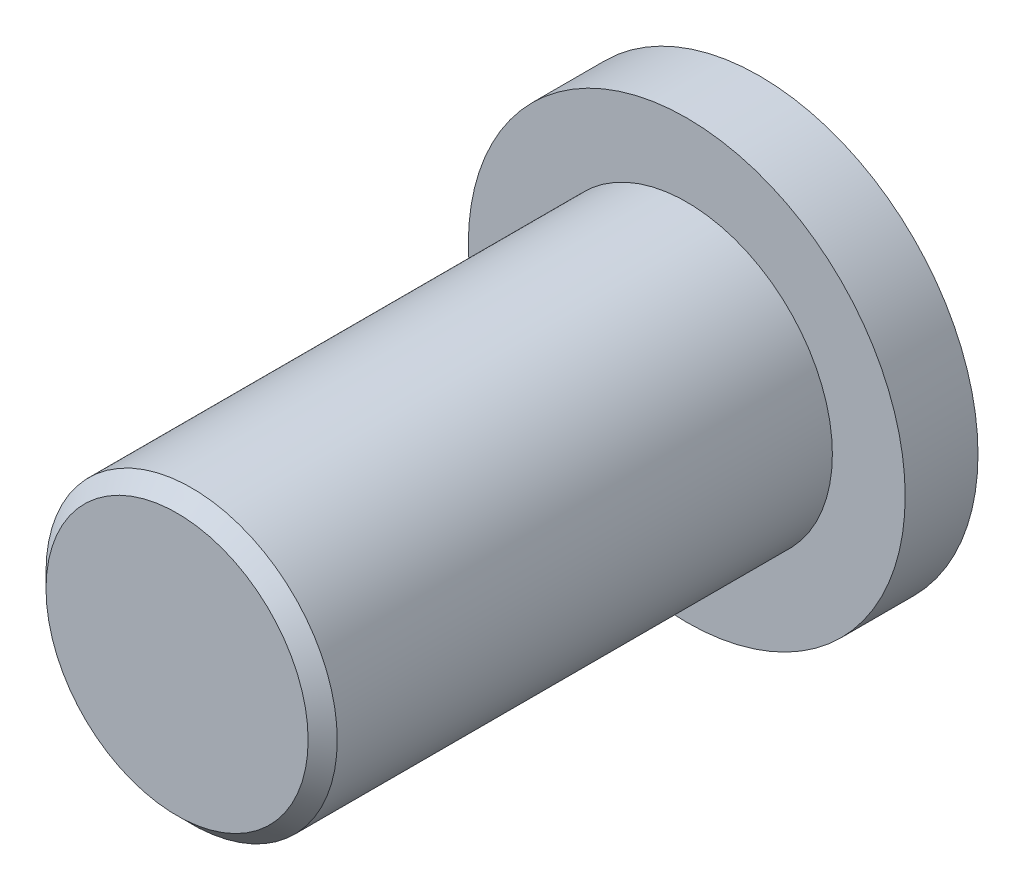
ISO-10303-21;
HEADER;
FILE_DESCRIPTION(('STEP AP214'),'2;1');
FILE_NAME('part.step','',(''),(''),'','','');
FILE_SCHEMA(('AUTOMOTIVE_DESIGN { 1 0 10303 214 1 1 1 1 }'));
ENDSEC;
DATA;
#1=APPLICATION_CONTEXT('core data for automotive mechanical design processes');
#2=APPLICATION_PROTOCOL_DEFINITION('international standard','automotive_design',2000,#1);
#3=PRODUCT_CONTEXT('',#1,'mechanical');
#4=PRODUCT('Part','Part','',(#3));
#5=PRODUCT_RELATED_PRODUCT_CATEGORY('part','',(#4));
#6=PRODUCT_DEFINITION_FORMATION('','',#4);
#7=PRODUCT_DEFINITION_CONTEXT('part definition',#1,'design');
#8=PRODUCT_DEFINITION('design','',#6,#7);
#9=PRODUCT_DEFINITION_SHAPE('','',#8);
#10=(LENGTH_UNIT() NAMED_UNIT(*) SI_UNIT(.MILLI.,.METRE.));
#11=(NAMED_UNIT(*) PLANE_ANGLE_UNIT() SI_UNIT($,.RADIAN.));
#12=(NAMED_UNIT(*) SI_UNIT($,.STERADIAN.) SOLID_ANGLE_UNIT());
#13=UNCERTAINTY_MEASURE_WITH_UNIT(LENGTH_MEASURE(1.E-05),#10,'distance_accuracy_value','');
#14=(GEOMETRIC_REPRESENTATION_CONTEXT(3) GLOBAL_UNCERTAINTY_ASSIGNED_CONTEXT((#13)) GLOBAL_UNIT_ASSIGNED_CONTEXT((#10,
#11,#12)) REPRESENTATION_CONTEXT('',''));
#15=CARTESIAN_POINT('',(0.,0.,0.));
#16=DIRECTION('',(0.,0.,1.));
#17=DIRECTION('',(1.,0.,0.));
#18=AXIS2_PLACEMENT_3D('',#15,#16,#17);
#19=CARTESIAN_POINT('',(0.,0.,35.));
#20=DIRECTION('',(0.,0.,-1.));
#21=DIRECTION('',(-1.,0.,0.));
#22=AXIS2_PLACEMENT_3D('',#19,#20,#21);
#23=CYLINDRICAL_SURFACE('',#22,10.);
#24=CARTESIAN_POINT('',(0.,0.,34.));
#25=DIRECTION('',(0.,0.,1.));
#26=DIRECTION('',(1.,0.,0.));
#27=AXIS2_PLACEMENT_3D('',#24,#25,#26);
#28=CIRCLE('',#27,10.);
#29=CARTESIAN_POINT('',(10.,0.,34.));
#30=VERTEX_POINT('',#29);
#31=EDGE_CURVE('E10',#30,#30,#28,.F.);
#32=ORIENTED_EDGE('',*,*,#31,.T.);
#33=EDGE_LOOP('',(#32));
#34=FACE_BOUND('',#33,.T.);
#35=CARTESIAN_POINT('',(0.,0.,0.));
#36=DIRECTION('',(0.,0.,1.));
#37=DIRECTION('',(1.,0.,0.));
#38=AXIS2_PLACEMENT_3D('',#35,#36,#37);
#39=CIRCLE('',#38,10.);
#40=CARTESIAN_POINT('',(10.,0.,0.));
#41=VERTEX_POINT('',#40);
#42=EDGE_CURVE('E53',#41,#41,#39,.T.);
#43=ORIENTED_EDGE('',*,*,#42,.T.);
#44=EDGE_LOOP('',(#43));
#45=FACE_BOUND('',#44,.T.);
#46=ADVANCED_FACE('F39',(#34,#45),#23,.T.);
#47=CARTESIAN_POINT('',(0.,0.,35.));
#48=DIRECTION('',(0.,0.,1.));
#49=DIRECTION('',(1.,0.,0.));
#50=AXIS2_PLACEMENT_3D('',#47,#48,#49);
#51=PLANE('',#50);
#52=CARTESIAN_POINT('',(0.,0.,35.));
#53=DIRECTION('',(0.,0.,1.));
#54=DIRECTION('',(1.,0.,0.));
#55=AXIS2_PLACEMENT_3D('',#52,#53,#54);
#56=CIRCLE('',#55,8.99999999999999);
#57=CARTESIAN_POINT('',(8.99999999999999,0.,35.));
#58=VERTEX_POINT('',#57);
#59=EDGE_CURVE('E48',#58,#58,#56,.T.);
#60=ORIENTED_EDGE('',*,*,#59,.T.);
#61=EDGE_LOOP('',(#60));
#62=FACE_BOUND('',#61,.T.);
#63=ADVANCED_FACE('F74',(#62),#51,.T.);
#64=CARTESIAN_POINT('',(0.,0.,-5.));
#65=DIRECTION('',(0.,0.,1.));
#66=DIRECTION('',(1.,0.,0.));
#67=AXIS2_PLACEMENT_3D('',#64,#65,#66);
#68=CYLINDRICAL_SURFACE('',#67,15.);
#69=CARTESIAN_POINT('',(0.,0.,-5.));
#70=DIRECTION('',(0.,0.,-1.));
#71=DIRECTION('',(-1.,0.,0.));
#72=AXIS2_PLACEMENT_3D('',#69,#70,#71);
#73=CIRCLE('',#72,15.);
#74=CARTESIAN_POINT('',(-15.,0.,-5.));
#75=VERTEX_POINT('',#74);
#76=EDGE_CURVE('E58',#75,#75,#73,.T.);
#77=ORIENTED_EDGE('',*,*,#76,.F.);
#78=EDGE_LOOP('',(#77));
#79=FACE_BOUND('',#78,.T.);
#80=CARTESIAN_POINT('',(0.,0.,0.));
#81=DIRECTION('',(0.,0.,-1.));
#82=DIRECTION('',(-1.,0.,0.));
#83=AXIS2_PLACEMENT_3D('',#80,#81,#82);
#84=CIRCLE('',#83,15.);
#85=CARTESIAN_POINT('',(-15.,0.,0.));
#86=VERTEX_POINT('',#85);
#87=EDGE_CURVE('E61',#86,#86,#84,.T.);
#88=ORIENTED_EDGE('',*,*,#87,.T.);
#89=EDGE_LOOP('',(#88));
#90=FACE_BOUND('',#89,.T.);
#91=ADVANCED_FACE('F71',(#79,#90),#68,.T.);
#92=CARTESIAN_POINT('',(0.,0.,-5.));
#93=DIRECTION('',(0.,0.,-1.));
#94=DIRECTION('',(-1.,0.,0.));
#95=AXIS2_PLACEMENT_3D('',#92,#93,#94);
#96=PLANE('',#95);
#97=ORIENTED_EDGE('',*,*,#76,.T.);
#98=EDGE_LOOP('',(#97));
#99=FACE_BOUND('',#98,.T.);
#100=ADVANCED_FACE('F69',(#99),#96,.T.);
#101=CARTESIAN_POINT('',(0.,0.,0.));
#102=DIRECTION('',(0.,0.,-1.));
#103=DIRECTION('',(-1.,0.,0.));
#104=AXIS2_PLACEMENT_3D('',#101,#102,#103);
#105=PLANE('',#104);
#106=ORIENTED_EDGE('',*,*,#42,.F.);
#107=EDGE_LOOP('',(#106));
#108=FACE_BOUND('',#107,.T.);
#109=ORIENTED_EDGE('',*,*,#87,.F.);
#110=EDGE_LOOP('',(#109));
#111=FACE_BOUND('',#110,.T.);
#112=ADVANCED_FACE('F78',(#108,#111),#105,.F.);
#113=CARTESIAN_POINT('',(0.,0.,35.));
#114=DIRECTION('',(0.,0.,-1.));
#115=DIRECTION('',(-1.,0.,0.));
#116=AXIS2_PLACEMENT_3D('',#113,#114,#115);
#117=CONICAL_SURFACE('',#116,8.99999999999999,0.78539816339745);
#118=ORIENTED_EDGE('',*,*,#31,.F.);
#119=EDGE_LOOP('',(#118));
#120=FACE_BOUND('',#119,.T.);
#121=ORIENTED_EDGE('',*,*,#59,.F.);
#122=EDGE_LOOP('',(#121));
#123=FACE_BOUND('',#122,.T.);
#124=ADVANCED_FACE('F42',(#120,#123),#117,.T.);
#125=CLOSED_SHELL('',(#46,#63,#91,#100,#112,#124));
#126=MANIFOLD_SOLID_BREP('B2',#125);
#127=ADVANCED_BREP_SHAPE_REPRESENTATION('',(#18,#126),#14);
#128=SHAPE_DEFINITION_REPRESENTATION(#9,#127);
ENDSEC;
END-ISO-10303-21;
